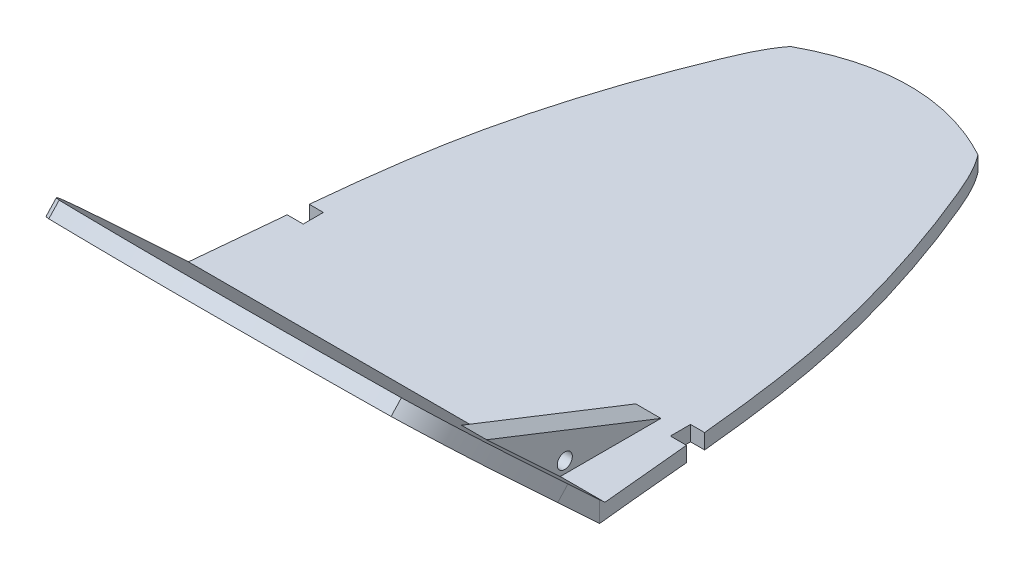
ISO-10303-21;
HEADER;
FILE_DESCRIPTION(('STEP AP214'),'2;1');
FILE_NAME('part.step','',(''),(''),'','','');
FILE_SCHEMA(('AUTOMOTIVE_DESIGN { 1 0 10303 214 1 1 1 1 }'));
ENDSEC;
DATA;
#1=APPLICATION_CONTEXT('core data for automotive mechanical design processes');
#2=APPLICATION_PROTOCOL_DEFINITION('international standard','automotive_design',2000,#1);
#3=PRODUCT_CONTEXT('',#1,'mechanical');
#4=PRODUCT('Part','Part','',(#3));
#5=PRODUCT_RELATED_PRODUCT_CATEGORY('part','',(#4));
#6=PRODUCT_DEFINITION_FORMATION('','',#4);
#7=PRODUCT_DEFINITION_CONTEXT('part definition',#1,'design');
#8=PRODUCT_DEFINITION('design','',#6,#7);
#9=PRODUCT_DEFINITION_SHAPE('','',#8);
#10=(LENGTH_UNIT() NAMED_UNIT(*) SI_UNIT(.MILLI.,.METRE.));
#11=(NAMED_UNIT(*) PLANE_ANGLE_UNIT() SI_UNIT($,.RADIAN.));
#12=(NAMED_UNIT(*) SI_UNIT($,.STERADIAN.) SOLID_ANGLE_UNIT());
#13=UNCERTAINTY_MEASURE_WITH_UNIT(LENGTH_MEASURE(1.E-05),#10,'distance_accuracy_value','');
#14=(GEOMETRIC_REPRESENTATION_CONTEXT(3) GLOBAL_UNCERTAINTY_ASSIGNED_CONTEXT((#13)) GLOBAL_UNIT_ASSIGNED_CONTEXT((#10,
#11,#12)) REPRESENTATION_CONTEXT('',''));
#15=CARTESIAN_POINT('',(0.,0.,0.));
#16=DIRECTION('',(0.,0.,1.));
#17=DIRECTION('',(1.,0.,0.));
#18=AXIS2_PLACEMENT_3D('',#15,#16,#17);
#19=CARTESIAN_POINT('',(41.5,-6.1E-05,0.));
#20=CARTESIAN_POINT('',(39.6682193805933,-6.1E-05,-16.7398807497697));
#21=CARTESIAN_POINT('',(38.2403029810651,-6.1E-05,-47.0286694822381));
#22=CARTESIAN_POINT('',(26.7654572723187,-6.1E-05,-81.8879522658567));
#23=CARTESIAN_POINT('',(20.1547277826536,-6.1E-05,-96.5343382263916));
#24=CARTESIAN_POINT('',(17.,-6.1E-05,-100.));
#25=B_SPLINE_CURVE_WITH_KNOTS('',3,(#19,#20,#21,#22,#23,#24),.UNSPECIFIED.,.F.,.F.,(4,1,1,4),
(0.,0.382344480512107,0.700509354646539,0.78904711192076),.UNSPECIFIED.);
#26=DIRECTION('',(0.,1.,0.));
#27=VECTOR('',#26,1.);
#28=SURFACE_OF_LINEAR_EXTRUSION('',#25,#27);
#29=DIRECTION('',(0.,1.,0.));
#30=VECTOR('',#29,1.);
#31=CARTESIAN_POINT('',(39.275966439861,2.06329713879901,-23.0876337792392));
#32=LINE('',#31,#30);
#33=CARTESIAN_POINT('',(39.2759664396858,0.,-23.0876337792392));
#34=VERTEX_POINT('',#33);
#35=CARTESIAN_POINT('',(39.275966439861,3.,-23.0876337792392));
#36=VERTEX_POINT('',#35);
#37=EDGE_CURVE('E11',#34,#36,#32,.T.);
#38=ORIENTED_EDGE('',*,*,#37,.F.);
#39=CARTESIAN_POINT('',(41.5,0.,0.));
#40=CARTESIAN_POINT('',(39.6682193805933,0.,-16.7398807497697));
#41=CARTESIAN_POINT('',(38.2403029810651,0.,-47.0286694822381));
#42=CARTESIAN_POINT('',(26.7654572723187,0.,-81.8879522658567));
#43=CARTESIAN_POINT('',(20.1547277826536,0.,-96.5343382263916));
#44=CARTESIAN_POINT('',(17.,0.,-100.));
#45=B_SPLINE_CURVE_WITH_KNOTS('',3,(#39,#40,#41,#42,#43,#44),.UNSPECIFIED.,.F.,.F.,(4,1,1,4),
(0.,0.382344480512107,0.700509354646539,0.78904711192076),.UNSPECIFIED.);
#46=CARTESIAN_POINT('',(18.6340167954174,0.,-98.0383289539755));
#47=VERTEX_POINT('',#46);
#48=EDGE_CURVE('E296',#47,#34,#45,.F.);
#49=ORIENTED_EDGE('',*,*,#48,.F.);
#50=DIRECTION('',(0.,1.,0.));
#51=VECTOR('',#50,1.);
#52=CARTESIAN_POINT('',(18.6340167954174,-6.1E-05,-98.0383289539755));
#53=LINE('',#52,#51);
#54=CARTESIAN_POINT('',(18.6340167954174,3.,-98.0383289539755));
#55=VERTEX_POINT('',#54);
#56=EDGE_CURVE('E398',#47,#55,#53,.T.);
#57=ORIENTED_EDGE('',*,*,#56,.T.);
#58=CARTESIAN_POINT('',(41.5,3.,0.));
#59=CARTESIAN_POINT('',(39.6682193805933,3.,-16.7398807497697));
#60=CARTESIAN_POINT('',(38.2403029810651,3.,-47.0286694822381));
#61=CARTESIAN_POINT('',(26.7654572723187,3.,-81.8879522658567));
#62=CARTESIAN_POINT('',(20.1547277826536,3.,-96.5343382263916));
#63=CARTESIAN_POINT('',(17.,3.,-100.));
#64=B_SPLINE_CURVE_WITH_KNOTS('',3,(#58,#59,#60,#61,#62,#63),.UNSPECIFIED.,.F.,.F.,(4,1,1,4),
(0.,0.382344480512107,0.700509354646539,0.78904711192076),.UNSPECIFIED.);
#65=EDGE_CURVE('E301',#55,#36,#64,.F.);
#66=ORIENTED_EDGE('',*,*,#65,.T.);
#67=EDGE_LOOP('',(#38,#49,#57,#66));
#68=FACE_BOUND('',#67,.T.);
#69=ADVANCED_FACE('F33',(#68),#28,.T.);
#70=CARTESIAN_POINT('',(-41.5,-6.1E-05,0.));
#71=CARTESIAN_POINT('',(-39.6682193805933,-6.1E-05,-16.7398807497697));
#72=CARTESIAN_POINT('',(-38.2403029810651,-6.1E-05,-47.028669482238));
#73=CARTESIAN_POINT('',(-26.7654572723187,-6.1E-05,-81.8879522658567));
#74=CARTESIAN_POINT('',(-20.1547277826537,-6.1E-05,-96.5343382263915));
#75=CARTESIAN_POINT('',(-17.,-6.1E-05,-100.));
#76=B_SPLINE_CURVE_WITH_KNOTS('',3,(#70,#71,#72,#73,#74,#75),.UNSPECIFIED.,.F.,.F.,(4,1,1,4),
(0.,0.382344480512107,0.700509354646539,0.789047111920761),.UNSPECIFIED.);
#77=DIRECTION('',(0.,1.,0.));
#78=VECTOR('',#77,1.);
#79=SURFACE_OF_LINEAR_EXTRUSION('',#76,#78);
#80=CARTESIAN_POINT('',(-41.5,0.,0.));
#81=CARTESIAN_POINT('',(-39.6682193805933,0.,-16.7398807497697));
#82=CARTESIAN_POINT('',(-38.2403029810651,0.,-47.028669482238));
#83=CARTESIAN_POINT('',(-26.7654572723187,0.,-81.8879522658567));
#84=CARTESIAN_POINT('',(-20.1547277826537,0.,-96.5343382263915));
#85=CARTESIAN_POINT('',(-17.,0.,-100.));
#86=B_SPLINE_CURVE_WITH_KNOTS('',3,(#80,#81,#82,#83,#84,#85),.UNSPECIFIED.,.F.,.F.,(4,1,1,4),
(0.,0.382344480512107,0.700509354646539,0.789047111920761),.UNSPECIFIED.);
#87=CARTESIAN_POINT('',(-18.6340167954174,0.,-98.0383289539755));
#88=VERTEX_POINT('',#87);
#89=CARTESIAN_POINT('',(-39.2759664396858,0.,-23.0876337792392));
#90=VERTEX_POINT('',#89);
#91=EDGE_CURVE('E272',#88,#90,#86,.F.);
#92=ORIENTED_EDGE('',*,*,#91,.T.);
#93=DIRECTION('',(0.,1.,0.));
#94=VECTOR('',#93,1.);
#95=CARTESIAN_POINT('',(-39.275966439861,2.06329713879901,-23.0876337792392));
#96=LINE('',#95,#94);
#97=CARTESIAN_POINT('',(-39.275966439861,3.,-23.0876337792392));
#98=VERTEX_POINT('',#97);
#99=EDGE_CURVE('E436',#90,#98,#96,.T.);
#100=ORIENTED_EDGE('',*,*,#99,.T.);
#101=CARTESIAN_POINT('',(-41.5,3.,0.));
#102=CARTESIAN_POINT('',(-39.6682193805933,3.,-16.7398807497697));
#103=CARTESIAN_POINT('',(-38.2403029810651,3.,-47.028669482238));
#104=CARTESIAN_POINT('',(-26.7654572723187,3.,-81.8879522658567));
#105=CARTESIAN_POINT('',(-20.1547277826537,3.,-96.5343382263915));
#106=CARTESIAN_POINT('',(-17.,3.,-100.));
#107=B_SPLINE_CURVE_WITH_KNOTS('',3,(#101,#102,#103,#104,#105,#106),.UNSPECIFIED.,.F.,.F.,(4,1,
1,4),(0.,0.382344480512107,0.700509354646539,0.789047111920761),.UNSPECIFIED.);
#108=CARTESIAN_POINT('',(-18.6340167954174,3.,-98.0383289539755));
#109=VERTEX_POINT('',#108);
#110=EDGE_CURVE('E278',#109,#98,#107,.F.);
#111=ORIENTED_EDGE('',*,*,#110,.F.);
#112=DIRECTION('',(0.,1.,0.));
#113=VECTOR('',#112,1.);
#114=CARTESIAN_POINT('',(-18.6340167954174,-6.1E-05,-98.0383289539755));
#115=LINE('',#114,#113);
#116=EDGE_CURVE('E395',#88,#109,#115,.T.);
#117=ORIENTED_EDGE('',*,*,#116,.F.);
#118=EDGE_LOOP('',(#92,#100,#111,#117));
#119=FACE_BOUND('',#118,.T.);
#120=ADVANCED_FACE('F366',(#119),#79,.F.);
#121=CARTESIAN_POINT('',(0.,3.,0.));
#122=DIRECTION('',(0.,-1.,0.));
#123=DIRECTION('',(0.,0.,-1.));
#124=AXIS2_PLACEMENT_3D('',#121,#122,#123);
#125=PLANE('',#124);
#126=DIRECTION('',(0.,0.,-1.));
#127=VECTOR('',#126,1.);
#128=CARTESIAN_POINT('',(36.4703546700886,3.,0.));
#129=LINE('',#128,#127);
#130=CARTESIAN_POINT('',(36.4703546700886,3.,-19.0876337792392));
#131=VERTEX_POINT('',#130);
#132=CARTESIAN_POINT('',(36.4703546700886,3.,-23.0876337792392));
#133=VERTEX_POINT('',#132);
#134=EDGE_CURVE('E178',#131,#133,#129,.T.);
#135=ORIENTED_EDGE('',*,*,#134,.T.);
#136=DIRECTION('',(1.,0.,0.));
#137=VECTOR('',#136,1.);
#138=CARTESIAN_POINT('',(0.,3.,-23.0876337792392));
#139=LINE('',#138,#137);
#140=EDGE_CURVE('E195',#133,#36,#139,.T.);
#141=ORIENTED_EDGE('',*,*,#140,.T.);
#142=ORIENTED_EDGE('',*,*,#65,.F.);
#143=CARTESIAN_POINT('',(-30.,3.,-90.));
#144=CARTESIAN_POINT('',(0.,3.,-116.175267558494));
#145=CARTESIAN_POINT('',(30.,3.,-90.));
#146=B_SPLINE_CURVE_WITH_KNOTS('',2,(#143,#144,#145),.UNSPECIFIED.,.F.,.F.,(3,3),(0.,1.),.UNSPECIFIED.);
#147=EDGE_CURVE('E343',#55,#109,#146,.F.);
#148=ORIENTED_EDGE('',*,*,#147,.T.);
#149=ORIENTED_EDGE('',*,*,#110,.T.);
#150=DIRECTION('',(1.,0.,0.));
#151=VECTOR('',#150,1.);
#152=CARTESIAN_POINT('',(0.,3.,-23.0876337792392));
#153=LINE('',#152,#151);
#154=CARTESIAN_POINT('',(-36.4703546700886,3.,-23.0876337792392));
#155=VERTEX_POINT('',#154);
#156=EDGE_CURVE('E215',#98,#155,#153,.T.);
#157=ORIENTED_EDGE('',*,*,#156,.T.);
#158=DIRECTION('',(0.,0.,1.));
#159=VECTOR('',#158,1.);
#160=CARTESIAN_POINT('',(-36.4703546700886,3.,0.));
#161=LINE('',#160,#159);
#162=CARTESIAN_POINT('',(-36.4703546700886,3.,-19.0876337792392));
#163=VERTEX_POINT('',#162);
#164=EDGE_CURVE('E218',#155,#163,#161,.T.);
#165=ORIENTED_EDGE('',*,*,#164,.T.);
#166=DIRECTION('',(-1.,0.,0.));
#167=VECTOR('',#166,1.);
#168=CARTESIAN_POINT('',(0.,3.,-19.0876337792392));
#169=LINE('',#168,#167);
#170=CARTESIAN_POINT('',(-39.6599762396156,3.,-19.0876337792392));
#171=VERTEX_POINT('',#170);
#172=EDGE_CURVE('E210',#163,#171,#169,.T.);
#173=ORIENTED_EDGE('',*,*,#172,.T.);
#174=CARTESIAN_POINT('',(-41.3723519108045,3.,-1.18173142721903));
#175=VERTEX_POINT('',#174);
#176=EDGE_CURVE('E277',#171,#175,#107,.F.);
#177=ORIENTED_EDGE('',*,*,#176,.T.);
#178=DIRECTION('',(1.,0.,0.));
#179=VECTOR('',#178,1.);
#180=CARTESIAN_POINT('',(-48.5,3.00000000000716,-1.18173142683986));
#181=LINE('',#180,#179);
#182=CARTESIAN_POINT('',(27.5,3.,-1.18173142652992));
#183=VERTEX_POINT('',#182);
#184=EDGE_CURVE('E401',#175,#183,#181,.T.);
#185=ORIENTED_EDGE('',*,*,#184,.T.);
#186=DIRECTION('',(0.,1.06867639737551E-12,-1.));
#187=VECTOR('',#186,1.);
#188=CARTESIAN_POINT('',(27.5,3.,-1.18173142652992));
#189=LINE('',#188,#187);
#190=CARTESIAN_POINT('',(27.5,3.00000000002137,-21.1817314265299));
#191=VERTEX_POINT('',#190);
#192=EDGE_CURVE('E336',#183,#191,#189,.T.);
#193=ORIENTED_EDGE('',*,*,#192,.T.);
#194=DIRECTION('',(1.,0.,0.));
#195=VECTOR('',#194,1.);
#196=CARTESIAN_POINT('',(27.5,3.00000000002137,-21.1817314265299));
#197=LINE('',#196,#195);
#198=CARTESIAN_POINT('',(32.5,3.00000000002137,-21.1817314265299));
#199=VERTEX_POINT('',#198);
#200=EDGE_CURVE('E340',#191,#199,#197,.T.);
#201=ORIENTED_EDGE('',*,*,#200,.T.);
#202=DIRECTION('',(0.,1.06867639737551E-12,-1.));
#203=VECTOR('',#202,1.);
#204=CARTESIAN_POINT('',(32.5,3.,-1.18173142652992));
#205=LINE('',#204,#203);
#206=CARTESIAN_POINT('',(32.5,3.00000000000716,-1.18173142683986));
#207=VERTEX_POINT('',#206);
#208=EDGE_CURVE('E328',#207,#199,#205,.T.);
#209=ORIENTED_EDGE('',*,*,#208,.F.);
#210=CARTESIAN_POINT('',(41.3723519108045,3.,-1.18173142721903));
#211=VERTEX_POINT('',#210);
#212=EDGE_CURVE('E442',#207,#211,#181,.T.);
#213=ORIENTED_EDGE('',*,*,#212,.T.);
#214=CARTESIAN_POINT('',(39.6599762396156,3.,-19.0876337792392));
#215=VERTEX_POINT('',#214);
#216=EDGE_CURVE('E300',#215,#211,#64,.F.);
#217=ORIENTED_EDGE('',*,*,#216,.F.);
#218=DIRECTION('',(-1.,0.,0.));
#219=VECTOR('',#218,1.);
#220=CARTESIAN_POINT('',(0.,3.,-19.0876337792392));
#221=LINE('',#220,#219);
#222=EDGE_CURVE('E49',#215,#131,#221,.T.);
#223=ORIENTED_EDGE('',*,*,#222,.T.);
#224=EDGE_LOOP('',(#135,#141,#142,#148,#149,#157,#165,#173,#177,#185,#193,#201,#209,#213,#217,#223));
#225=FACE_BOUND('',#224,.T.);
#226=ADVANCED_FACE('F363',(#225),#125,.F.);
#227=CARTESIAN_POINT('',(0.,0.,0.));
#228=DIRECTION('',(0.,-1.,0.));
#229=DIRECTION('',(0.,0.,-1.));
#230=AXIS2_PLACEMENT_3D('',#227,#228,#229);
#231=PLANE('',#230);
#232=DIRECTION('',(-1.,0.,0.));
#233=VECTOR('',#232,1.);
#234=CARTESIAN_POINT('',(36.4703546700886,0.,-23.0876337792392));
#235=LINE('',#234,#233);
#236=CARTESIAN_POINT('',(36.4703546700886,0.,-23.0876337792392));
#237=VERTEX_POINT('',#236);
#238=EDGE_CURVE('E180',#34,#237,#235,.T.);
#239=ORIENTED_EDGE('',*,*,#238,.T.);
#240=DIRECTION('',(0.,0.,1.));
#241=VECTOR('',#240,1.);
#242=CARTESIAN_POINT('',(36.4703546700886,0.,-19.0876337792392));
#243=LINE('',#242,#241);
#244=CARTESIAN_POINT('',(36.4703546700886,0.,-19.0876337792392));
#245=VERTEX_POINT('',#244);
#246=EDGE_CURVE('E175',#237,#245,#243,.T.);
#247=ORIENTED_EDGE('',*,*,#246,.T.);
#248=DIRECTION('',(1.,0.,0.));
#249=VECTOR('',#248,1.);
#250=CARTESIAN_POINT('',(36.4703546700886,0.,-19.0876337792392));
#251=LINE('',#250,#249);
#252=CARTESIAN_POINT('',(39.6599762392842,0.,-19.0876337792392));
#253=VERTEX_POINT('',#252);
#254=EDGE_CURVE('E183',#245,#253,#251,.T.);
#255=ORIENTED_EDGE('',*,*,#254,.T.);
#256=CARTESIAN_POINT('',(41.5,0.,0.));
#257=VERTEX_POINT('',#256);
#258=EDGE_CURVE('E295',#253,#257,#45,.F.);
#259=ORIENTED_EDGE('',*,*,#258,.T.);
#260=DIRECTION('',(1.,0.,0.));
#261=VECTOR('',#260,1.);
#262=CARTESIAN_POINT('',(-48.5,0.,0.));
#263=LINE('',#262,#261);
#264=CARTESIAN_POINT('',(-41.5,0.,0.));
#265=VERTEX_POINT('',#264);
#266=EDGE_CURVE('E396',#265,#257,#263,.T.);
#267=ORIENTED_EDGE('',*,*,#266,.F.);
#268=CARTESIAN_POINT('',(-39.6599762392842,0.,-19.0876337827703));
#269=VERTEX_POINT('',#268);
#270=EDGE_CURVE('E267',#269,#265,#86,.F.);
#271=ORIENTED_EDGE('',*,*,#270,.F.);
#272=DIRECTION('',(1.,0.,0.));
#273=VECTOR('',#272,1.);
#274=CARTESIAN_POINT('',(-36.4703546700886,0.,-19.0876337792392));
#275=LINE('',#274,#273);
#276=CARTESIAN_POINT('',(-36.4703546700886,0.,-19.0876337792392));
#277=VERTEX_POINT('',#276);
#278=EDGE_CURVE('E57',#269,#277,#275,.T.);
#279=ORIENTED_EDGE('',*,*,#278,.T.);
#280=DIRECTION('',(0.,0.,-1.));
#281=VECTOR('',#280,1.);
#282=CARTESIAN_POINT('',(-36.4703546700886,0.,-19.0876337792392));
#283=LINE('',#282,#281);
#284=CARTESIAN_POINT('',(-36.4703546700886,0.,-23.0876337792392));
#285=VERTEX_POINT('',#284);
#286=EDGE_CURVE('E200',#277,#285,#283,.T.);
#287=ORIENTED_EDGE('',*,*,#286,.T.);
#288=DIRECTION('',(-1.,0.,0.));
#289=VECTOR('',#288,1.);
#290=CARTESIAN_POINT('',(-36.4703546700886,0.,-23.0876337792392));
#291=LINE('',#290,#289);
#292=EDGE_CURVE('E203',#285,#90,#291,.T.);
#293=ORIENTED_EDGE('',*,*,#292,.T.);
#294=ORIENTED_EDGE('',*,*,#91,.F.);
#295=CARTESIAN_POINT('',(-30.,0.,-90.));
#296=CARTESIAN_POINT('',(0.,0.,-116.175267558494));
#297=CARTESIAN_POINT('',(30.,0.,-90.));
#298=B_SPLINE_CURVE_WITH_KNOTS('',2,(#295,#296,#297),.UNSPECIFIED.,.F.,.F.,(3,3),(0.,1.),.UNSPECIFIED.);
#299=EDGE_CURVE('E393',#47,#88,#298,.F.);
#300=ORIENTED_EDGE('',*,*,#299,.F.);
#301=ORIENTED_EDGE('',*,*,#48,.T.);
#302=EDGE_LOOP('',(#239,#247,#255,#259,#267,#271,#279,#287,#293,#294,#300,#301));
#303=FACE_BOUND('',#302,.T.);
#304=ADVANCED_FACE('F188',(#303),#231,.T.);
#305=CARTESIAN_POINT('',(-30.,-1.2E-05,-90.));
#306=CARTESIAN_POINT('',(0.,-1.2E-05,-116.175267558494));
#307=CARTESIAN_POINT('',(30.,-1.2E-05,-90.));
#308=B_SPLINE_CURVE_WITH_KNOTS('',2,(#305,#306,#307),.UNSPECIFIED.,.F.,.F.,(3,3),(0.,1.),.UNSPECIFIED.);
#309=DIRECTION('',(0.,1.,0.));
#310=VECTOR('',#309,1.);
#311=SURFACE_OF_LINEAR_EXTRUSION('',#308,#310);
#312=ORIENTED_EDGE('',*,*,#56,.F.);
#313=ORIENTED_EDGE('',*,*,#299,.T.);
#314=ORIENTED_EDGE('',*,*,#116,.T.);
#315=ORIENTED_EDGE('',*,*,#147,.F.);
#316=EDGE_LOOP('',(#312,#313,#314,#315));
#317=FACE_BOUND('',#316,.T.);
#318=ADVANCED_FACE('F356',(#317),#311,.F.);
#319=CARTESIAN_POINT('',(-48.5,3.00000000000716,-1.18173142683986));
#320=DIRECTION('',(0.,0.731353701619196,-0.681998360062472));
#321=DIRECTION('',(0.,0.681998360062472,0.731353701619196));
#322=AXIS2_PLACEMENT_3D('',#319,#320,#321);
#323=PLANE('',#322);
#324=DIRECTION('',(0.,-0.681998360062472,-0.731353701619196));
#325=VECTOR('',#324,1.);
#326=CARTESIAN_POINT('',(-41.5,3.00000000000716,-1.18173142683986));
#327=LINE('',#326,#325);
#328=CARTESIAN_POINT('',(-41.5,9.9641156145585,6.28636825119985));
#329=VERTEX_POINT('',#328);
#330=CARTESIAN_POINT('',(-41.5,4.10198238329823,0.));
#331=VERTEX_POINT('',#330);
#332=EDGE_CURVE('E513',#329,#331,#327,.T.);
#333=ORIENTED_EDGE('',*,*,#332,.F.);
#334=CARTESIAN_POINT('',(-34.,33.8340582228222,31.8837478143865));
#335=CARTESIAN_POINT('',(-37.0896874632382,32.0590135619718,29.9802454611942));
#336=CARTESIAN_POINT('',(-40.4825828384432,27.4843423840544,25.0745112313437));
#337=CARTESIAN_POINT('',(-42.3149017719211,16.4825368071802,13.2765191769287));
#338=CARTESIAN_POINT('',(-41.1302851707483,8.19874628063281,4.39324141586032));
#339=CARTESIAN_POINT('',(-41.5,2.1940611048589,-2.04599508018878));
#340=B_SPLINE_CURVE_WITH_KNOTS('',3,(#334,#335,#336,#337,#338,#339),.UNSPECIFIED.,.F.,.F.,(4,1,
1,4),(0.,0.244098157111981,0.453483068680431,1.),.UNSPECIFIED.);
#341=CARTESIAN_POINT('',(-34.,33.8340582228221,31.8837478143866));
#342=VERTEX_POINT('',#341);
#343=EDGE_CURVE('E271',#329,#342,#340,.F.);
#344=ORIENTED_EDGE('',*,*,#343,.T.);
#345=CARTESIAN_POINT('',(-34.,33.8340582228221,31.8837478143866));
#346=CARTESIAN_POINT('',(0.,40.6540418234471,39.1972848305783));
#347=CARTESIAN_POINT('',(34.,33.8340582228221,31.8837478143866));
#348=B_SPLINE_CURVE_WITH_KNOTS('',2,(#345,#346,#347),.UNSPECIFIED.,.F.,.F.,(3,3),(0.,1.),.UNSPECIFIED.);
#349=CARTESIAN_POINT('',(34.,33.8340582228221,31.8837478143866));
#350=VERTEX_POINT('',#349);
#351=EDGE_CURVE('E519',#350,#342,#348,.F.);
#352=ORIENTED_EDGE('',*,*,#351,.F.);
#353=CARTESIAN_POINT('',(34.,33.8340582228222,31.8837478143865));
#354=CARTESIAN_POINT('',(37.0896874632382,32.0590135619718,29.9802454611943));
#355=CARTESIAN_POINT('',(40.4825828384432,27.4843423840544,25.0745112313437));
#356=CARTESIAN_POINT('',(42.3149017719211,16.4825368071802,13.2765191769287));
#357=CARTESIAN_POINT('',(41.1302851707483,8.19874628063281,4.39324141586031));
#358=CARTESIAN_POINT('',(41.5,2.1940611048589,-2.04599508018878));
#359=B_SPLINE_CURVE_WITH_KNOTS('',3,(#353,#354,#355,#356,#357,#358),.UNSPECIFIED.,.F.,.F.,(4,1,
1,4),(0.,0.244098157111981,0.453483068680431,1.),.UNSPECIFIED.);
#360=CARTESIAN_POINT('',(41.5,9.96411561455869,6.28636825119959));
#361=VERTEX_POINT('',#360);
#362=EDGE_CURVE('E523',#361,#350,#359,.F.);
#363=ORIENTED_EDGE('',*,*,#362,.F.);
#364=DIRECTION('',(0.,-0.681998360062472,-0.731353701619196));
#365=VECTOR('',#364,1.);
#366=CARTESIAN_POINT('',(41.5,3.00000000000716,-1.18173142683986));
#367=LINE('',#366,#365);
#368=CARTESIAN_POINT('',(41.5,4.10198238329823,0.));
#369=VERTEX_POINT('',#368);
#370=EDGE_CURVE('E462',#361,#369,#367,.T.);
#371=ORIENTED_EDGE('',*,*,#370,.T.);
#372=CARTESIAN_POINT('',(41.5,4.10198238329823,0.));
#373=CARTESIAN_POINT('',(41.4784534954743,3.91833329782373,-0.196939532887522));
#374=CARTESIAN_POINT('',(41.4570429024466,3.73467688979619,-0.393886918251797));
#375=CARTESIAN_POINT('',(41.4144935393876,3.36734942863502,-0.787797393933874));
#376=CARTESIAN_POINT('',(41.3933547693562,3.18367837550138,-0.984760484251678));
#377=CARTESIAN_POINT('',(41.3723519108229,2.99999999981471,-1.18173142704625));
#378=B_SPLINE_CURVE_WITH_KNOTS('',3,(#372,#373,#374,#375,#376,#377),.UNSPECIFIED.,.F.,.F.,(4,2,
4),(0.,0.810424123991122,1.62084824798224),.UNSPECIFIED.);
#379=EDGE_CURVE('E308',#369,#211,#378,.T.);
#380=ORIENTED_EDGE('',*,*,#379,.T.);
#381=ORIENTED_EDGE('',*,*,#212,.F.);
#382=DIRECTION('',(0.,-0.681998360070393,-0.731353701611809));
#383=VECTOR('',#382,1.);
#384=CARTESIAN_POINT('',(32.5,16.639967201404,13.4453426057021));
#385=LINE('',#384,#383);
#386=CARTESIAN_POINT('',(32.5,16.639967201404,13.4453426057021));
#387=VERTEX_POINT('',#386);
#388=EDGE_CURVE('E326',#387,#207,#385,.T.);
#389=ORIENTED_EDGE('',*,*,#388,.F.);
#390=DIRECTION('',(1.,0.,0.));
#391=VECTOR('',#390,1.);
#392=CARTESIAN_POINT('',(27.5,16.639967201404,13.4453426057021));
#393=LINE('',#392,#391);
#394=CARTESIAN_POINT('',(27.5,16.639967201404,13.4453426057021));
#395=VERTEX_POINT('',#394);
#396=EDGE_CURVE('E339',#395,#387,#393,.T.);
#397=ORIENTED_EDGE('',*,*,#396,.F.);
#398=DIRECTION('',(0.,-0.681998360070393,-0.731353701611809));
#399=VECTOR('',#398,1.);
#400=CARTESIAN_POINT('',(27.5,16.639967201404,13.4453426057021));
#401=LINE('',#400,#399);
#402=EDGE_CURVE('E333',#395,#183,#401,.T.);
#403=ORIENTED_EDGE('',*,*,#402,.T.);
#404=ORIENTED_EDGE('',*,*,#184,.F.);
#405=CARTESIAN_POINT('',(-41.5,4.10198238329823,0.));
#406=CARTESIAN_POINT('',(-41.4784534954743,3.91833329782373,-0.196939532887523));
#407=CARTESIAN_POINT('',(-41.4570429024466,3.73467688979619,-0.393886918251798));
#408=CARTESIAN_POINT('',(-41.4144935393876,3.36734942863502,-0.787797393933875));
#409=CARTESIAN_POINT('',(-41.3933547693562,3.18367837550138,-0.984760484251678));
#410=CARTESIAN_POINT('',(-41.3723519108229,2.99999999981471,-1.18173142704624));
#411=B_SPLINE_CURVE_WITH_KNOTS('',3,(#405,#406,#407,#408,#409,#410),.UNSPECIFIED.,.F.,.F.,(4,2,
4),(0.,0.810424123991121,1.62084824798224),.UNSPECIFIED.);
#412=EDGE_CURVE('E286',#331,#175,#411,.T.);
#413=ORIENTED_EDGE('',*,*,#412,.F.);
#414=EDGE_LOOP('',(#333,#344,#352,#363,#371,#380,#381,#389,#397,#403,#404,#413));
#415=FACE_BOUND('',#414,.T.);
#416=ADVANCED_FACE('F35',(#415),#323,.T.);
#417=CARTESIAN_POINT('',(-48.5,40.3618437787671,43.2827783472547));
#418=DIRECTION('',(0.,-0.731353701619174,0.681998360062494));
#419=DIRECTION('',(0.,-0.681998360062494,-0.731353701619174));
#420=AXIS2_PLACEMENT_3D('',#417,#418,#419);
#421=PLANE('',#420);
#422=DIRECTION('',(0.,0.681998360062494,0.731353701619174));
#423=VECTOR('',#422,1.);
#424=CARTESIAN_POINT('',(-41.5,40.3618437787671,43.2827783472547));
#425=LINE('',#424,#423);
#426=CARTESIAN_POINT('',(-41.5,7.77005450969984,8.33236333138838));
#427=VERTEX_POINT('',#426);
#428=EDGE_CURVE('E503',#265,#427,#425,.T.);
#429=ORIENTED_EDGE('',*,*,#428,.F.);
#430=ORIENTED_EDGE('',*,*,#266,.T.);
#431=DIRECTION('',(0.,0.681998360062494,0.731353701619174));
#432=VECTOR('',#431,1.);
#433=CARTESIAN_POINT('',(41.5,40.3618437787671,43.2827783472547));
#434=LINE('',#433,#432);
#435=CARTESIAN_POINT('',(41.5,7.77005450969986,8.3323633313883));
#436=VERTEX_POINT('',#435);
#437=EDGE_CURVE('E515',#257,#436,#434,.T.);
#438=ORIENTED_EDGE('',*,*,#437,.T.);
#439=CARTESIAN_POINT('',(34.,31.6399971179633,33.9297428945753));
#440=CARTESIAN_POINT('',(37.0896874632382,29.8649524571129,32.026240541383));
#441=CARTESIAN_POINT('',(40.4825828384432,25.2902812791955,27.1205063115325));
#442=CARTESIAN_POINT('',(42.3149017719211,14.2884757023213,15.3225142571175));
#443=CARTESIAN_POINT('',(41.1302851707483,6.00468517577393,6.43923649604906));
#444=CARTESIAN_POINT('',(41.5,0.,0.));
#445=B_SPLINE_CURVE_WITH_KNOTS('',3,(#439,#440,#441,#442,#443,#444),.UNSPECIFIED.,.F.,.F.,(4,1,
1,4),(0.,0.244098157111981,0.453483068680431,1.),.UNSPECIFIED.);
#446=CARTESIAN_POINT('',(34.,31.6399971179633,33.9297428945753));
#447=VERTEX_POINT('',#446);
#448=EDGE_CURVE('E416',#447,#436,#445,.T.);
#449=ORIENTED_EDGE('',*,*,#448,.F.);
#450=CARTESIAN_POINT('',(-34.,31.6399971179633,33.9297428945753));
#451=CARTESIAN_POINT('',(0.,38.4599807185882,41.2432799107671));
#452=CARTESIAN_POINT('',(34.,31.6399971179633,33.9297428945753));
#453=B_SPLINE_CURVE_WITH_KNOTS('',2,(#450,#451,#452),.UNSPECIFIED.,.F.,.F.,(3,3),(0.,1.),.UNSPECIFIED.);
#454=CARTESIAN_POINT('',(-34.,31.6399971179633,33.9297428945753));
#455=VERTEX_POINT('',#454);
#456=EDGE_CURVE('E412',#455,#447,#453,.T.);
#457=ORIENTED_EDGE('',*,*,#456,.F.);
#458=CARTESIAN_POINT('',(-34.,31.6399971179633,33.9297428945753));
#459=CARTESIAN_POINT('',(-37.0896874632382,29.8649524571129,32.026240541383));
#460=CARTESIAN_POINT('',(-40.4825828384432,25.2902812791955,27.1205063115325));
#461=CARTESIAN_POINT('',(-42.3149017719211,14.2884757023213,15.3225142571175));
#462=CARTESIAN_POINT('',(-41.1302851707483,6.00468517577393,6.43923649604908));
#463=CARTESIAN_POINT('',(-41.5,0.,0.));
#464=B_SPLINE_CURVE_WITH_KNOTS('',3,(#458,#459,#460,#461,#462,#463),.UNSPECIFIED.,.F.,.F.,(4,1,
1,4),(0.,0.244098157111981,0.453483068680431,1.),.UNSPECIFIED.);
#465=EDGE_CURVE('E423',#455,#427,#464,.T.);
#466=ORIENTED_EDGE('',*,*,#465,.T.);
#467=EDGE_LOOP('',(#429,#430,#438,#449,#457,#466));
#468=FACE_BOUND('',#467,.T.);
#469=ADVANCED_FACE('F369',(#468),#421,.T.);
#470=CARTESIAN_POINT('',(27.5,3.00000000002137,-21.1817314265299));
#471=DIRECTION('',(0.,0.930417567980263,-0.36650122672877));
#472=DIRECTION('',(0.,0.36650122672877,0.930417567980263));
#473=AXIS2_PLACEMENT_3D('',#470,#471,#472);
#474=PLANE('',#473);
#475=ORIENTED_EDGE('',*,*,#396,.T.);
#476=DIRECTION('',(0.,0.36650122672877,0.930417567980263));
#477=VECTOR('',#476,1.);
#478=CARTESIAN_POINT('',(32.5,3.00000000002137,-21.1817314265299));
#479=LINE('',#478,#477);
#480=EDGE_CURVE('E323',#199,#387,#479,.T.);
#481=ORIENTED_EDGE('',*,*,#480,.F.);
#482=ORIENTED_EDGE('',*,*,#200,.F.);
#483=DIRECTION('',(0.,0.36650122672877,0.930417567980263));
#484=VECTOR('',#483,1.);
#485=CARTESIAN_POINT('',(27.5,3.00000000002137,-21.1817314265299));
#486=LINE('',#485,#484);
#487=EDGE_CURVE('E330',#191,#395,#486,.T.);
#488=ORIENTED_EDGE('',*,*,#487,.T.);
#489=EDGE_LOOP('',(#475,#481,#482,#488));
#490=FACE_BOUND('',#489,.T.);
#491=ADVANCED_FACE('F361',(#490),#474,.T.);
#492=CARTESIAN_POINT('',(27.5,0.,0.));
#493=DIRECTION('',(1.,0.,0.));
#494=DIRECTION('',(0.,0.,-1.));
#495=AXIS2_PLACEMENT_3D('',#492,#493,#494);
#496=PLANE('',#495);
#497=CARTESIAN_POINT('',(27.5,5.27589437424134,-2.08115900335803));
#498=DIRECTION('',(1.,0.,0.));
#499=DIRECTION('',(0.,0.,-1.));
#500=AXIS2_PLACEMENT_3D('',#497,#498,#499);
#501=CIRCLE('',#500,1.5);
#502=CARTESIAN_POINT('',(27.5,5.27589437424134,-3.58115900335803));
#503=VERTEX_POINT('',#502);
#504=EDGE_CURVE('E320',#503,#503,#501,.F.);
#505=ORIENTED_EDGE('',*,*,#504,.F.);
#506=EDGE_LOOP('',(#505));
#507=FACE_BOUND('',#506,.T.);
#508=ORIENTED_EDGE('',*,*,#487,.F.);
#509=ORIENTED_EDGE('',*,*,#192,.F.);
#510=ORIENTED_EDGE('',*,*,#402,.F.);
#511=EDGE_LOOP('',(#508,#509,#510));
#512=FACE_BOUND('',#511,.T.);
#513=ADVANCED_FACE('F376',(#507,#512),#496,.F.);
#514=CARTESIAN_POINT('',(32.5,0.,0.));
#515=DIRECTION('',(1.,0.,0.));
#516=DIRECTION('',(0.,0.,-1.));
#517=AXIS2_PLACEMENT_3D('',#514,#515,#516);
#518=PLANE('',#517);
#519=CARTESIAN_POINT('',(32.5,5.27589437424134,-2.08115900335803));
#520=DIRECTION('',(1.,0.,0.));
#521=DIRECTION('',(0.,0.,-1.));
#522=AXIS2_PLACEMENT_3D('',#519,#520,#521);
#523=CIRCLE('',#522,1.5);
#524=CARTESIAN_POINT('',(32.5,5.27589437424134,-3.58115900335803));
#525=VERTEX_POINT('',#524);
#526=EDGE_CURVE('E317',#525,#525,#523,.T.);
#527=ORIENTED_EDGE('',*,*,#526,.F.);
#528=EDGE_LOOP('',(#527));
#529=FACE_BOUND('',#528,.T.);
#530=ORIENTED_EDGE('',*,*,#480,.T.);
#531=ORIENTED_EDGE('',*,*,#388,.T.);
#532=ORIENTED_EDGE('',*,*,#208,.T.);
#533=EDGE_LOOP('',(#530,#531,#532));
#534=FACE_BOUND('',#533,.T.);
#535=ADVANCED_FACE('F458',(#529,#534),#518,.T.);
#536=CARTESIAN_POINT('',(-48.501055,5.27589437424134,-2.08115900335803));
#537=DIRECTION('',(1.,0.,0.));
#538=DIRECTION('',(0.,0.,-1.));
#539=AXIS2_PLACEMENT_3D('',#536,#537,#538);
#540=CYLINDRICAL_SURFACE('',#539,1.5);
#541=ORIENTED_EDGE('',*,*,#526,.T.);
#542=EDGE_LOOP('',(#541));
#543=FACE_BOUND('',#542,.T.);
#544=ORIENTED_EDGE('',*,*,#504,.T.);
#545=EDGE_LOOP('',(#544));
#546=FACE_BOUND('',#545,.T.);
#547=ADVANCED_FACE('F248',(#543,#546),#540,.F.);
#548=DIRECTION('',(0.,1.,0.));
#549=VECTOR('',#548,1.);
#550=CARTESIAN_POINT('',(39.6599762396156,2.06329713879901,-19.0876337792392));
#551=LINE('',#550,#549);
#552=EDGE_CURVE('E42',#215,#253,#551,.F.);
#553=ORIENTED_EDGE('',*,*,#552,.F.);
#554=ORIENTED_EDGE('',*,*,#216,.T.);
#555=ORIENTED_EDGE('',*,*,#379,.F.);
#556=DIRECTION('',(0.,1.,0.));
#557=VECTOR('',#556,1.);
#558=CARTESIAN_POINT('',(41.5,-6.1E-05,0.));
#559=LINE('',#558,#557);
#560=EDGE_CURVE('E262',#257,#369,#559,.T.);
#561=ORIENTED_EDGE('',*,*,#560,.F.);
#562=ORIENTED_EDGE('',*,*,#258,.F.);
#563=EDGE_LOOP('',(#553,#554,#555,#561,#562));
#564=FACE_BOUND('',#563,.T.);
#565=ADVANCED_FACE('F243',(#564),#28,.T.);
#566=ORIENTED_EDGE('',*,*,#176,.F.);
#567=DIRECTION('',(0.,1.,0.));
#568=VECTOR('',#567,1.);
#569=CARTESIAN_POINT('',(-39.6599762396156,2.06329713879901,-19.0876337792392));
#570=LINE('',#569,#568);
#571=EDGE_CURVE('E431',#171,#269,#570,.F.);
#572=ORIENTED_EDGE('',*,*,#571,.T.);
#573=ORIENTED_EDGE('',*,*,#270,.T.);
#574=DIRECTION('',(0.,1.,0.));
#575=VECTOR('',#574,1.);
#576=CARTESIAN_POINT('',(-41.5,-6.1E-05,0.));
#577=LINE('',#576,#575);
#578=EDGE_CURVE('E268',#265,#331,#577,.T.);
#579=ORIENTED_EDGE('',*,*,#578,.T.);
#580=ORIENTED_EDGE('',*,*,#412,.T.);
#581=EDGE_LOOP('',(#566,#572,#573,#579,#580));
#582=FACE_BOUND('',#581,.T.);
#583=ADVANCED_FACE('F239',(#582),#79,.F.);
#584=CARTESIAN_POINT('',(-34.,105.820538411709,-35.2447309596996));
#585=CARTESIAN_POINT('',(-37.0896874632382,104.045493750859,-37.1482333128919));
#586=CARTESIAN_POINT('',(-40.4825828384432,99.4708225729412,-42.0539675427424));
#587=CARTESIAN_POINT('',(-42.3149017719211,88.4690169960671,-53.8519595971574));
#588=CARTESIAN_POINT('',(-41.1302851707483,80.1852264695197,-62.7352373582258));
#589=CARTESIAN_POINT('',(-41.5,74.1805412937457,-69.1744738542749));
#590=B_SPLINE_CURVE_WITH_KNOTS('',3,(#584,#585,#586,#587,#588,#589),.UNSPECIFIED.,.F.,.F.,(4,1,
1,4),(0.,0.244098157111981,0.453483068680431,1.),.UNSPECIFIED.);
#591=DIRECTION('',(0.,-0.731353701619174,0.681998360062494));
#592=VECTOR('',#591,1.);
#593=SURFACE_OF_LINEAR_EXTRUSION('',#590,#592);
#594=DIRECTION('',(0.,-0.731353701619174,0.681998360062494));
#595=VECTOR('',#594,1.);
#596=CARTESIAN_POINT('',(-41.5,81.9505958034456,-60.8421105228865));
#597=LINE('',#596,#595);
#598=EDGE_CURVE('E497',#329,#427,#597,.T.);
#599=ORIENTED_EDGE('',*,*,#598,.T.);
#600=ORIENTED_EDGE('',*,*,#465,.F.);
#601=DIRECTION('',(0.,-0.731353701619174,0.681998360062494));
#602=VECTOR('',#601,1.);
#603=CARTESIAN_POINT('',(-34.,105.820538411709,-35.2447309596996));
#604=LINE('',#603,#602);
#605=EDGE_CURVE('E221',#342,#455,#604,.T.);
#606=ORIENTED_EDGE('',*,*,#605,.F.);
#607=ORIENTED_EDGE('',*,*,#343,.F.);
#608=EDGE_LOOP('',(#599,#600,#606,#607));
#609=FACE_BOUND('',#608,.T.);
#610=ADVANCED_FACE('F234',(#609),#593,.T.);
#611=CARTESIAN_POINT('',(-41.5,74.1805412937457,-69.1744738542749));
#612=DIRECTION('',(1.,0.,0.));
#613=DIRECTION('',(0.,0.,-1.));
#614=AXIS2_PLACEMENT_3D('',#611,#612,#613);
#615=PLANE('',#614);
#616=ORIENTED_EDGE('',*,*,#332,.T.);
#617=ORIENTED_EDGE('',*,*,#578,.F.);
#618=ORIENTED_EDGE('',*,*,#428,.T.);
#619=ORIENTED_EDGE('',*,*,#598,.F.);
#620=EDGE_LOOP('',(#616,#617,#618,#619));
#621=FACE_BOUND('',#620,.T.);
#622=ADVANCED_FACE('F238',(#621),#615,.F.);
#623=CARTESIAN_POINT('',(41.5,74.1805412937457,-69.1744738542749));
#624=DIRECTION('',(1.,0.,0.));
#625=DIRECTION('',(0.,0.,-1.));
#626=AXIS2_PLACEMENT_3D('',#623,#624,#625);
#627=PLANE('',#626);
#628=DIRECTION('',(0.,-0.731353701619174,0.681998360062494));
#629=VECTOR('',#628,1.);
#630=CARTESIAN_POINT('',(41.5,81.9505958034456,-60.8421105228866));
#631=LINE('',#630,#629);
#632=EDGE_CURVE('E504',#361,#436,#631,.T.);
#633=ORIENTED_EDGE('',*,*,#632,.T.);
#634=ORIENTED_EDGE('',*,*,#437,.F.);
#635=ORIENTED_EDGE('',*,*,#560,.T.);
#636=ORIENTED_EDGE('',*,*,#370,.F.);
#637=EDGE_LOOP('',(#633,#634,#635,#636));
#638=FACE_BOUND('',#637,.T.);
#639=ADVANCED_FACE('F486',(#638),#627,.T.);
#640=CARTESIAN_POINT('',(34.,105.820538411709,-35.2447309596996));
#641=CARTESIAN_POINT('',(37.0896874632382,104.045493750859,-37.1482333128919));
#642=CARTESIAN_POINT('',(40.4825828384432,99.4708225729412,-42.0539675427424));
#643=CARTESIAN_POINT('',(42.3149017719211,88.4690169960671,-53.8519595971574));
#644=CARTESIAN_POINT('',(41.1302851707483,80.1852264695197,-62.7352373582259));
#645=CARTESIAN_POINT('',(41.5,74.1805412937457,-69.1744738542749));
#646=B_SPLINE_CURVE_WITH_KNOTS('',3,(#640,#641,#642,#643,#644,#645),.UNSPECIFIED.,.F.,.F.,(4,1,
1,4),(0.,0.244098157111981,0.453483068680431,1.),.UNSPECIFIED.);
#647=DIRECTION('',(0.,-0.731353701619174,0.681998360062494));
#648=VECTOR('',#647,1.);
#649=SURFACE_OF_LINEAR_EXTRUSION('',#646,#648);
#650=ORIENTED_EDGE('',*,*,#362,.T.);
#651=DIRECTION('',(0.,-0.731353701619174,0.681998360062494));
#652=VECTOR('',#651,1.);
#653=CARTESIAN_POINT('',(34.,105.820538411709,-35.2447309596996));
#654=LINE('',#653,#652);
#655=EDGE_CURVE('E507',#350,#447,#654,.T.);
#656=ORIENTED_EDGE('',*,*,#655,.T.);
#657=ORIENTED_EDGE('',*,*,#448,.T.);
#658=ORIENTED_EDGE('',*,*,#632,.F.);
#659=EDGE_LOOP('',(#650,#656,#657,#658));
#660=FACE_BOUND('',#659,.T.);
#661=ADVANCED_FACE('F489',(#660),#649,.F.);
#662=CARTESIAN_POINT('',(-34.,105.820538411709,-35.2447309596996));
#663=CARTESIAN_POINT('',(0.,112.640522012334,-27.9311939435079));
#664=CARTESIAN_POINT('',(34.,105.820538411709,-35.2447309596996));
#665=B_SPLINE_CURVE_WITH_KNOTS('',2,(#662,#663,#664),.UNSPECIFIED.,.F.,.F.,(3,3),(0.,1.),.UNSPECIFIED.);
#666=DIRECTION('',(0.,-0.731353701619174,0.681998360062494));
#667=VECTOR('',#666,1.);
#668=SURFACE_OF_LINEAR_EXTRUSION('',#665,#667);
#669=ORIENTED_EDGE('',*,*,#351,.T.);
#670=ORIENTED_EDGE('',*,*,#605,.T.);
#671=ORIENTED_EDGE('',*,*,#456,.T.);
#672=ORIENTED_EDGE('',*,*,#655,.F.);
#673=EDGE_LOOP('',(#669,#670,#671,#672));
#674=FACE_BOUND('',#673,.T.);
#675=ADVANCED_FACE('F241',(#674),#668,.F.);
#676=CARTESIAN_POINT('',(-36.4703546700886,0.,-19.0876337792392));
#677=DIRECTION('',(1.,0.,0.));
#678=DIRECTION('',(0.,0.,-1.));
#679=AXIS2_PLACEMENT_3D('',#676,#677,#678);
#680=PLANE('',#679);
#681=DIRECTION('',(0.,1.,0.));
#682=VECTOR('',#681,1.);
#683=CARTESIAN_POINT('',(-36.4703546700886,0.,-23.0876337792392));
#684=LINE('',#683,#682);
#685=EDGE_CURVE('E207',#285,#155,#684,.T.);
#686=ORIENTED_EDGE('',*,*,#685,.F.);
#687=ORIENTED_EDGE('',*,*,#286,.F.);
#688=DIRECTION('',(0.,1.,0.));
#689=VECTOR('',#688,1.);
#690=CARTESIAN_POINT('',(-36.4703546700886,0.,-19.0876337792392));
#691=LINE('',#690,#689);
#692=EDGE_CURVE('E206',#277,#163,#691,.T.);
#693=ORIENTED_EDGE('',*,*,#692,.T.);
#694=ORIENTED_EDGE('',*,*,#164,.F.);
#695=EDGE_LOOP('',(#686,#687,#693,#694));
#696=FACE_BOUND('',#695,.T.);
#697=ADVANCED_FACE('F478',(#696),#680,.F.);
#698=CARTESIAN_POINT('',(-36.4703546700886,0.,-23.0876337792392));
#699=DIRECTION('',(0.,0.,-1.));
#700=DIRECTION('',(-1.,0.,0.));
#701=AXIS2_PLACEMENT_3D('',#698,#699,#700);
#702=PLANE('',#701);
#703=ORIENTED_EDGE('',*,*,#99,.F.);
#704=ORIENTED_EDGE('',*,*,#292,.F.);
#705=ORIENTED_EDGE('',*,*,#685,.T.);
#706=ORIENTED_EDGE('',*,*,#156,.F.);
#707=EDGE_LOOP('',(#703,#704,#705,#706));
#708=FACE_BOUND('',#707,.T.);
#709=ADVANCED_FACE('F475',(#708),#702,.F.);
#710=CARTESIAN_POINT('',(-36.4703546700886,0.,-19.0876337792392));
#711=DIRECTION('',(0.,0.,1.));
#712=DIRECTION('',(1.,0.,0.));
#713=AXIS2_PLACEMENT_3D('',#710,#711,#712);
#714=PLANE('',#713);
#715=ORIENTED_EDGE('',*,*,#692,.F.);
#716=ORIENTED_EDGE('',*,*,#278,.F.);
#717=ORIENTED_EDGE('',*,*,#571,.F.);
#718=ORIENTED_EDGE('',*,*,#172,.F.);
#719=EDGE_LOOP('',(#715,#716,#717,#718));
#720=FACE_BOUND('',#719,.T.);
#721=ADVANCED_FACE('F472',(#720),#714,.F.);
#722=CARTESIAN_POINT('',(36.4703546700886,0.,-19.0876337792392));
#723=DIRECTION('',(-1.,0.,0.));
#724=DIRECTION('',(0.,0.,1.));
#725=AXIS2_PLACEMENT_3D('',#722,#723,#724);
#726=PLANE('',#725);
#727=DIRECTION('',(0.,1.,0.));
#728=VECTOR('',#727,1.);
#729=CARTESIAN_POINT('',(36.4703546700886,0.,-19.0876337792392));
#730=LINE('',#729,#728);
#731=EDGE_CURVE('E170',#245,#131,#730,.T.);
#732=ORIENTED_EDGE('',*,*,#731,.F.);
#733=ORIENTED_EDGE('',*,*,#246,.F.);
#734=DIRECTION('',(0.,1.,0.));
#735=VECTOR('',#734,1.);
#736=CARTESIAN_POINT('',(36.4703546700886,0.,-23.0876337792392));
#737=LINE('',#736,#735);
#738=EDGE_CURVE('E179',#237,#133,#737,.T.);
#739=ORIENTED_EDGE('',*,*,#738,.T.);
#740=ORIENTED_EDGE('',*,*,#134,.F.);
#741=EDGE_LOOP('',(#732,#733,#739,#740));
#742=FACE_BOUND('',#741,.T.);
#743=ADVANCED_FACE('F172',(#742),#726,.F.);
#744=CARTESIAN_POINT('',(36.4703546700886,0.,-23.0876337792392));
#745=DIRECTION('',(0.,0.,-1.));
#746=DIRECTION('',(-1.,0.,0.));
#747=AXIS2_PLACEMENT_3D('',#744,#745,#746);
#748=PLANE('',#747);
#749=ORIENTED_EDGE('',*,*,#738,.F.);
#750=ORIENTED_EDGE('',*,*,#238,.F.);
#751=ORIENTED_EDGE('',*,*,#37,.T.);
#752=ORIENTED_EDGE('',*,*,#140,.F.);
#753=EDGE_LOOP('',(#749,#750,#751,#752));
#754=FACE_BOUND('',#753,.T.);
#755=ADVANCED_FACE('F464',(#754),#748,.F.);
#756=CARTESIAN_POINT('',(36.4703546700886,0.,-19.0876337792392));
#757=DIRECTION('',(0.,0.,1.));
#758=DIRECTION('',(1.,0.,0.));
#759=AXIS2_PLACEMENT_3D('',#756,#757,#758);
#760=PLANE('',#759);
#761=ORIENTED_EDGE('',*,*,#552,.T.);
#762=ORIENTED_EDGE('',*,*,#254,.F.);
#763=ORIENTED_EDGE('',*,*,#731,.T.);
#764=ORIENTED_EDGE('',*,*,#222,.F.);
#765=EDGE_LOOP('',(#761,#762,#763,#764));
#766=FACE_BOUND('',#765,.T.);
#767=ADVANCED_FACE('F184',(#766),#760,.F.);
#768=CLOSED_SHELL('',(#69,#120,#226,#304,#318,#416,#469,#491,#513,#535,#547,#565,#583,#610,#622,
#639,#661,#675,#697,#709,#721,#743,#755,#767));
#769=MANIFOLD_SOLID_BREP('B2',#768);
#770=ADVANCED_BREP_SHAPE_REPRESENTATION('',(#18,#769),#14);
#771=SHAPE_DEFINITION_REPRESENTATION(#9,#770);
ENDSEC;
END-ISO-10303-21;
